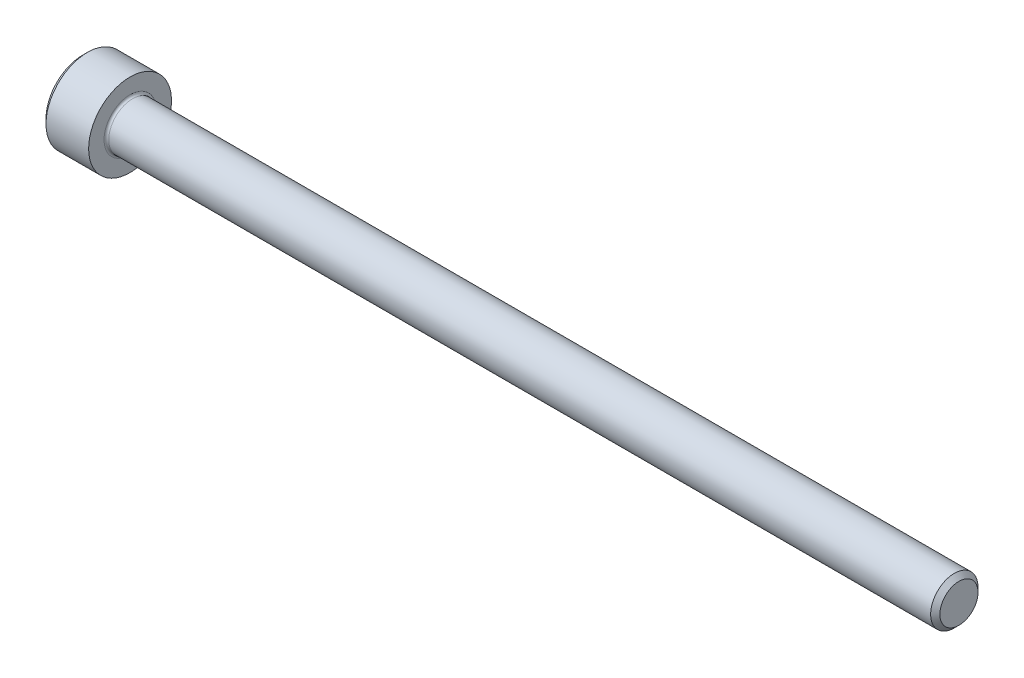
ISO-10303-21;
HEADER;
FILE_DESCRIPTION(('STEP AP214'),'2;1');
FILE_NAME('part.step','',(''),(''),'','','');
FILE_SCHEMA(('AUTOMOTIVE_DESIGN { 1 0 10303 214 1 1 1 1 }'));
ENDSEC;
DATA;
#1=APPLICATION_CONTEXT('core data for automotive mechanical design processes');
#2=APPLICATION_PROTOCOL_DEFINITION('international standard','automotive_design',2000,#1);
#3=PRODUCT_CONTEXT('',#1,'mechanical');
#4=PRODUCT('Part','Part','',(#3));
#5=PRODUCT_RELATED_PRODUCT_CATEGORY('part','',(#4));
#6=PRODUCT_DEFINITION_FORMATION('','',#4);
#7=PRODUCT_DEFINITION_CONTEXT('part definition',#1,'design');
#8=PRODUCT_DEFINITION('design','',#6,#7);
#9=PRODUCT_DEFINITION_SHAPE('','',#8);
#10=(LENGTH_UNIT() NAMED_UNIT(*) SI_UNIT(.MILLI.,.METRE.));
#11=(NAMED_UNIT(*) PLANE_ANGLE_UNIT() SI_UNIT($,.RADIAN.));
#12=(NAMED_UNIT(*) SI_UNIT($,.STERADIAN.) SOLID_ANGLE_UNIT());
#13=UNCERTAINTY_MEASURE_WITH_UNIT(LENGTH_MEASURE(1.E-05),#10,'distance_accuracy_value','');
#14=(GEOMETRIC_REPRESENTATION_CONTEXT(3) GLOBAL_UNCERTAINTY_ASSIGNED_CONTEXT((#13)) GLOBAL_UNIT_ASSIGNED_CONTEXT((#10,
#11,#12)) REPRESENTATION_CONTEXT('',''));
#15=CARTESIAN_POINT('',(0.,0.,0.));
#16=DIRECTION('',(0.,0.,1.));
#17=DIRECTION('',(1.,0.,0.));
#18=AXIS2_PLACEMENT_3D('',#15,#16,#17);
#19=CARTESIAN_POINT('',(0.,0.,0.));
#20=DIRECTION('',(-1.00000000000002,0.,0.));
#21=DIRECTION('',(0.,0.,1.00000000000002));
#22=AXIS2_PLACEMENT_3D('',#19,#20,#21);
#23=PLANE('',#22);
#24=DIRECTION('',(0.,-0.5,0.866025403784461));
#25=VECTOR('',#24,1.);
#26=CARTESIAN_POINT('',(4.32986979603811E-12,1.77304267668088,4.44089209850063E-13));
#27=LINE('',#26,#25);
#28=CARTESIAN_POINT('',(4.32986979603811E-12,1.77304267668088,4.44089209850063E-13));
#29=VERTEX_POINT('',#28);
#30=CARTESIAN_POINT('',(-3.33066907387547E-13,0.886521338340773,1.53550000000324));
#31=VERTEX_POINT('',#30);
#32=EDGE_CURVE('E280',#29,#31,#27,.T.);
#33=ORIENTED_EDGE('',*,*,#32,.T.);
#34=DIRECTION('',(0.,1.00000000000001,0.));
#35=VECTOR('',#34,1.);
#36=CARTESIAN_POINT('',(0.,-0.886521338340662,1.53550000001568));
#37=LINE('',#36,#35);
#38=CARTESIAN_POINT('',(0.,-0.886521338340662,1.53550000001568));
#39=VERTEX_POINT('',#38);
#40=EDGE_CURVE('E140',#39,#31,#37,.T.);
#41=ORIENTED_EDGE('',*,*,#40,.F.);
#42=DIRECTION('',(0.,-0.500000000000002,-0.866025403784466));
#43=VECTOR('',#42,1.);
#44=CARTESIAN_POINT('',(0.,-0.886521338340662,1.53550000001568));
#45=LINE('',#44,#43);
#46=CARTESIAN_POINT('',(2.77555756156289E-12,-1.77304267668132,-8.88178419700125E-12));
#47=VERTEX_POINT('',#46);
#48=EDGE_CURVE('E283',#39,#47,#45,.T.);
#49=ORIENTED_EDGE('',*,*,#48,.T.);
#50=DIRECTION('',(0.,0.5,-0.866025403784461));
#51=VECTOR('',#50,1.);
#52=CARTESIAN_POINT('',(2.77555756156289E-12,-1.77304267668132,-8.88178419700125E-12));
#53=LINE('',#52,#51);
#54=CARTESIAN_POINT('',(0.,-0.886521338340884,-1.53550000001124));
#55=VERTEX_POINT('',#54);
#56=EDGE_CURVE('E286',#47,#55,#53,.T.);
#57=ORIENTED_EDGE('',*,*,#56,.T.);
#58=DIRECTION('',(0.,-1.00000000000001,0.));
#59=VECTOR('',#58,1.);
#60=CARTESIAN_POINT('',(4.32986979603811E-12,0.886521338340884,-1.53550000000102));
#61=LINE('',#60,#59);
#62=CARTESIAN_POINT('',(4.32986979603811E-12,0.886521338340884,-1.53550000000102));
#63=VERTEX_POINT('',#62);
#64=EDGE_CURVE('E289',#63,#55,#61,.T.);
#65=ORIENTED_EDGE('',*,*,#64,.F.);
#66=DIRECTION('',(0.,-0.500000000000002,-0.866025403784466));
#67=VECTOR('',#66,1.);
#68=CARTESIAN_POINT('',(4.32986979603811E-12,1.77304267668088,4.44089209850063E-13));
#69=LINE('',#68,#67);
#70=EDGE_CURVE('E135',#29,#63,#69,.T.);
#71=ORIENTED_EDGE('',*,*,#70,.F.);
#72=EDGE_LOOP('',(#33,#41,#49,#57,#65,#71));
#73=FACE_BOUND('',#72,.T.);
#74=CARTESIAN_POINT('',(0.,0.,0.));
#75=DIRECTION('',(-1.00000000000002,0.,0.));
#76=DIRECTION('',(0.,0.,1.00000000000002));
#77=AXIS2_PLACEMENT_3D('',#74,#75,#76);
#78=CIRCLE('',#77,3.09999999999999);
#79=CARTESIAN_POINT('',(0.,0.,3.10000000000006));
#80=VERTEX_POINT('',#79);
#81=EDGE_CURVE('E164',#80,#80,#78,.T.);
#82=ORIENTED_EDGE('',*,*,#81,.T.);
#83=EDGE_LOOP('',(#82));
#84=FACE_BOUND('',#83,.T.);
#85=ADVANCED_FACE('F48',(#73,#84),#23,.T.);
#86=CARTESIAN_POINT('',(0.,0.,0.));
#87=DIRECTION('',(1.00000000000002,0.,0.));
#88=DIRECTION('',(0.,0.,-1.00000000000002));
#89=AXIS2_PLACEMENT_3D('',#86,#87,#88);
#90=CONICAL_SURFACE('',#89,3.09999999999999,0.785398163397459);
#91=CARTESIAN_POINT('',(0.400000000000067,0.,0.));
#92=DIRECTION('',(-1.00000000000002,0.,0.));
#93=DIRECTION('',(0.,0.,1.00000000000002));
#94=AXIS2_PLACEMENT_3D('',#91,#92,#93);
#95=CIRCLE('',#94,3.5);
#96=CARTESIAN_POINT('',(0.400000000000067,0.,3.50000000000008));
#97=VERTEX_POINT('',#96);
#98=EDGE_CURVE('E161',#97,#97,#95,.T.);
#99=ORIENTED_EDGE('',*,*,#98,.T.);
#100=EDGE_LOOP('',(#99));
#101=FACE_BOUND('',#100,.T.);
#102=ORIENTED_EDGE('',*,*,#81,.F.);
#103=EDGE_LOOP('',(#102));
#104=FACE_BOUND('',#103,.T.);
#105=ADVANCED_FACE('F185',(#101,#104),#90,.T.);
#106=CARTESIAN_POINT('',(-31.7500000000042,1.94289029309402E-13,1.33226762955019E-12));
#107=DIRECTION('',(-1.00000000000002,0.,0.));
#108=DIRECTION('',(0.,0.,1.00000000000002));
#109=AXIS2_PLACEMENT_3D('',#106,#107,#108);
#110=CYLINDRICAL_SURFACE('',#109,3.5);
#111=CARTESIAN_POINT('',(4.,2.22044604925031E-13,4.44089209850063E-13));
#112=DIRECTION('',(-1.00000000000002,0.,0.));
#113=DIRECTION('',(0.,0.,1.00000000000002));
#114=AXIS2_PLACEMENT_3D('',#111,#112,#113);
#115=CIRCLE('',#114,3.5);
#116=CARTESIAN_POINT('',(4.,2.2262747201296E-13,3.50000000000052));
#117=VERTEX_POINT('',#116);
#118=EDGE_CURVE('E158',#117,#117,#115,.T.);
#119=ORIENTED_EDGE('',*,*,#118,.T.);
#120=EDGE_LOOP('',(#119));
#121=FACE_BOUND('',#120,.T.);
#122=ORIENTED_EDGE('',*,*,#98,.F.);
#123=EDGE_LOOP('',(#122));
#124=FACE_BOUND('',#123,.T.);
#125=ADVANCED_FACE('F190',(#121,#124),#110,.T.);
#126=CARTESIAN_POINT('',(4.,3.49999999999939,-1.77635683940025E-12));
#127=DIRECTION('',(1.00000000000002,0.,0.));
#128=DIRECTION('',(0.,0.,-1.00000000000002));
#129=AXIS2_PLACEMENT_3D('',#126,#127,#128);
#130=PLANE('',#129);
#131=CARTESIAN_POINT('',(4.,2.22044604925031E-13,4.44089209850063E-13));
#132=DIRECTION('',(1.00000000000002,0.,0.));
#133=DIRECTION('',(0.,0.,-1.00000000000002));
#134=AXIS2_PLACEMENT_3D('',#131,#132,#133);
#135=CIRCLE('',#134,2.19999999999999);
#136=CARTESIAN_POINT('',(4.,2.21678231326905E-13,-2.19999999999959));
#137=VERTEX_POINT('',#136);
#138=EDGE_CURVE('E56',#137,#137,#135,.F.);
#139=ORIENTED_EDGE('',*,*,#138,.T.);
#140=EDGE_LOOP('',(#139));
#141=FACE_BOUND('',#140,.T.);
#142=ORIENTED_EDGE('',*,*,#118,.F.);
#143=EDGE_LOOP('',(#142));
#144=FACE_BOUND('',#143,.T.);
#145=ADVANCED_FACE('F169',(#141,#144),#130,.T.);
#146=CARTESIAN_POINT('',(-31.7500000000042,1.94289029309402E-13,1.33226762955019E-12));
#147=DIRECTION('',(-1.00000000000002,0.,0.));
#148=DIRECTION('',(0.,0.,1.00000000000002));
#149=AXIS2_PLACEMENT_3D('',#146,#147,#148);
#150=CYLINDRICAL_SURFACE('',#149,1.99999999999999);
#151=CARTESIAN_POINT('',(4.19999999999998,2.22044604925031E-13,4.44089209850063E-13));
#152=DIRECTION('',(1.00000000000002,0.,0.));
#153=DIRECTION('',(0.,0.,-1.00000000000002));
#154=AXIS2_PLACEMENT_3D('',#151,#152,#153);
#155=CIRCLE('',#154,1.99999999999999);
#156=CARTESIAN_POINT('',(4.19999999999998,2.21711538017644E-13,-1.99999999999959));
#157=VERTEX_POINT('',#156);
#158=EDGE_CURVE('E13',#157,#157,#155,.T.);
#159=ORIENTED_EDGE('',*,*,#158,.T.);
#160=EDGE_LOOP('',(#159));
#161=FACE_BOUND('',#160,.T.);
#162=CARTESIAN_POINT('',(73.6100000000003,0.,4.44089209850063E-13));
#163=DIRECTION('',(-1.00000000000002,0.,0.));
#164=DIRECTION('',(0.,0.,1.00000000000002));
#165=AXIS2_PLACEMENT_3D('',#162,#163,#164);
#166=CIRCLE('',#165,1.99999999999997);
#167=CARTESIAN_POINT('',(73.6100000000003,0.,2.00000000000046));
#168=VERTEX_POINT('',#167);
#169=EDGE_CURVE('E155',#168,#168,#166,.T.);
#170=ORIENTED_EDGE('',*,*,#169,.T.);
#171=EDGE_LOOP('',(#170));
#172=FACE_BOUND('',#171,.T.);
#173=ADVANCED_FACE('F200',(#161,#172),#150,.T.);
#174=CARTESIAN_POINT('',(74.0000000000003,0.,4.44089209850063E-13));
#175=DIRECTION('',(-1.00000000000002,0.,0.));
#176=DIRECTION('',(0.,0.,1.00000000000002));
#177=AXIS2_PLACEMENT_3D('',#174,#175,#176);
#178=CONICAL_SURFACE('',#177,1.61,0.785398163397393);
#179=ORIENTED_EDGE('',*,*,#169,.F.);
#180=EDGE_LOOP('',(#179));
#181=FACE_BOUND('',#180,.T.);
#182=CARTESIAN_POINT('',(74.0000000000003,0.,4.44089209850063E-13));
#183=DIRECTION('',(-1.00000000000002,0.,0.));
#184=DIRECTION('',(0.,0.,1.00000000000002));
#185=AXIS2_PLACEMENT_3D('',#182,#183,#184);
#186=CIRCLE('',#185,1.61);
#187=CARTESIAN_POINT('',(74.0000000000003,0.,1.61000000000048));
#188=VERTEX_POINT('',#187);
#189=EDGE_CURVE('E151',#188,#188,#186,.T.);
#190=ORIENTED_EDGE('',*,*,#189,.T.);
#191=EDGE_LOOP('',(#190));
#192=FACE_BOUND('',#191,.T.);
#193=ADVANCED_FACE('F180',(#181,#192),#178,.T.);
#194=CARTESIAN_POINT('',(74.0000000000048,1.6099999999992,0.));
#195=DIRECTION('',(1.00000000000002,0.,0.));
#196=DIRECTION('',(0.,0.,-1.00000000000002));
#197=AXIS2_PLACEMENT_3D('',#194,#195,#196);
#198=PLANE('',#197);
#199=ORIENTED_EDGE('',*,*,#189,.F.);
#200=EDGE_LOOP('',(#199));
#201=FACE_BOUND('',#200,.T.);
#202=ADVANCED_FACE('F173',(#201),#198,.T.);
#203=CARTESIAN_POINT('',(4.19999999999998,2.22044604925031E-13,4.44089209850063E-13));
#204=DIRECTION('',(1.00000000000002,0.,0.));
#205=DIRECTION('',(0.,0.,-1.00000000000002));
#206=AXIS2_PLACEMENT_3D('',#203,#204,#205);
#207=TOROIDAL_SURFACE('',#206,2.19999999999999,0.2);
#208=ORIENTED_EDGE('',*,*,#158,.F.);
#209=EDGE_LOOP('',(#208));
#210=FACE_BOUND('',#209,.T.);
#211=ORIENTED_EDGE('',*,*,#138,.F.);
#212=EDGE_LOOP('',(#211));
#213=FACE_BOUND('',#212,.T.);
#214=ADVANCED_FACE('F50',(#210,#213),#207,.F.);
#215=CARTESIAN_POINT('',(2.00000000000444,1.77304267668155,8.88178419700125E-13));
#216=DIRECTION('',(0.,-0.86602540378444,-0.500000000000009));
#217=DIRECTION('',(0.,0.5,-0.866025403784461));
#218=AXIS2_PLACEMENT_3D('',#215,#216,#217);
#219=PLANE('',#218);
#220=ORIENTED_EDGE('',*,*,#32,.F.);
#221=DIRECTION('',(-1.00000000000002,0.,0.));
#222=VECTOR('',#221,1.);
#223=CARTESIAN_POINT('',(2.00000000000444,1.77304267668155,8.88178419700125E-13));
#224=LINE('',#223,#222);
#225=CARTESIAN_POINT('',(2.00000000000444,1.77304267668155,8.88178419700125E-13));
#226=VERTEX_POINT('',#225);
#227=EDGE_CURVE('E279',#226,#29,#224,.T.);
#228=ORIENTED_EDGE('',*,*,#227,.F.);
#229=DIRECTION('',(0.,-0.5,0.866025403784461));
#230=VECTOR('',#229,1.);
#231=CARTESIAN_POINT('',(2.00000000000444,1.77304267668155,8.88178419700125E-13));
#232=LINE('',#231,#230);
#233=CARTESIAN_POINT('',(2.,1.32978200751088,0.767750000003176));
#234=VERTEX_POINT('',#233);
#235=EDGE_CURVE('E63',#226,#234,#232,.T.);
#236=ORIENTED_EDGE('',*,*,#235,.T.);
#237=CARTESIAN_POINT('',(1.99999999999978,0.886521338340662,1.53550000000235));
#238=VERTEX_POINT('',#237);
#239=EDGE_CURVE('E121',#234,#238,#232,.T.);
#240=ORIENTED_EDGE('',*,*,#239,.T.);
#241=DIRECTION('',(-1.00000000000002,0.,0.));
#242=VECTOR('',#241,1.);
#243=CARTESIAN_POINT('',(1.99999999999978,0.886521338340662,1.53550000000235));
#244=LINE('',#243,#242);
#245=EDGE_CURVE('E133',#238,#31,#244,.T.);
#246=ORIENTED_EDGE('',*,*,#245,.T.);
#247=EDGE_LOOP('',(#220,#228,#236,#240,#246));
#248=FACE_BOUND('',#247,.T.);
#249=ADVANCED_FACE('F132',(#248),#219,.T.);
#250=CARTESIAN_POINT('',(2.,-0.886521338341106,1.53550000001523));
#251=DIRECTION('',(0.,0.,1.00000000000003));
#252=DIRECTION('',(0.,-1.00000000000001,0.));
#253=AXIS2_PLACEMENT_3D('',#250,#251,#252);
#254=PLANE('',#253);
#255=ORIENTED_EDGE('',*,*,#40,.T.);
#256=ORIENTED_EDGE('',*,*,#245,.F.);
#257=DIRECTION('',(0.,1.00000000000001,0.));
#258=VECTOR('',#257,1.);
#259=CARTESIAN_POINT('',(2.,-0.886521338341106,1.53550000001523));
#260=LINE('',#259,#258);
#261=CARTESIAN_POINT('',(2.,2.22044604925031E-13,1.53550000000457));
#262=VERTEX_POINT('',#261);
#263=EDGE_CURVE('E119',#262,#238,#260,.T.);
#264=ORIENTED_EDGE('',*,*,#263,.F.);
#265=CARTESIAN_POINT('',(2.,-0.886521338341106,1.53550000001523));
#266=VERTEX_POINT('',#265);
#267=EDGE_CURVE('E129',#266,#262,#260,.T.);
#268=ORIENTED_EDGE('',*,*,#267,.F.);
#269=DIRECTION('',(-1.00000000000002,0.,0.));
#270=VECTOR('',#269,1.);
#271=CARTESIAN_POINT('',(2.,-0.886521338341106,1.53550000001523));
#272=LINE('',#271,#270);
#273=EDGE_CURVE('E142',#266,#39,#272,.T.);
#274=ORIENTED_EDGE('',*,*,#273,.T.);
#275=EDGE_LOOP('',(#255,#256,#264,#268,#274));
#276=FACE_BOUND('',#275,.T.);
#277=ADVANCED_FACE('F137',(#276),#254,.F.);
#278=CARTESIAN_POINT('',(2.,-0.886521338341106,1.53550000001523));
#279=DIRECTION('',(0.,0.866025403784445,-0.500000000000013));
#280=DIRECTION('',(0.,0.500000000000002,0.866025403784466));
#281=AXIS2_PLACEMENT_3D('',#278,#279,#280);
#282=PLANE('',#281);
#283=ORIENTED_EDGE('',*,*,#48,.F.);
#284=ORIENTED_EDGE('',*,*,#273,.F.);
#285=DIRECTION('',(0.,-0.500000000000002,-0.866025403784466));
#286=VECTOR('',#285,1.);
#287=CARTESIAN_POINT('',(2.,-0.886521338341106,1.53550000001523));
#288=LINE('',#287,#286);
#289=CARTESIAN_POINT('',(2.,-1.32978200751166,0.76775000000584));
#290=VERTEX_POINT('',#289);
#291=EDGE_CURVE('E260',#266,#290,#288,.T.);
#292=ORIENTED_EDGE('',*,*,#291,.T.);
#293=CARTESIAN_POINT('',(2.00000000000278,-1.7730426766811,-9.32587340685131E-12));
#294=VERTEX_POINT('',#293);
#295=EDGE_CURVE('E262',#290,#294,#288,.T.);
#296=ORIENTED_EDGE('',*,*,#295,.T.);
#297=DIRECTION('',(-1.00000000000002,0.,0.));
#298=VECTOR('',#297,1.);
#299=CARTESIAN_POINT('',(2.00000000000278,-1.7730426766811,-9.32587340685131E-12));
#300=LINE('',#299,#298);
#301=EDGE_CURVE('E147',#294,#47,#300,.T.);
#302=ORIENTED_EDGE('',*,*,#301,.T.);
#303=EDGE_LOOP('',(#283,#284,#292,#296,#302));
#304=FACE_BOUND('',#303,.T.);
#305=ADVANCED_FACE('F212',(#304),#282,.T.);
#306=CARTESIAN_POINT('',(2.00000000000278,-1.7730426766811,-9.32587340685131E-12));
#307=DIRECTION('',(0.,0.86602540378444,0.500000000000009));
#308=DIRECTION('',(0.,-0.5,0.866025403784461));
#309=AXIS2_PLACEMENT_3D('',#306,#307,#308);
#310=PLANE('',#309);
#311=ORIENTED_EDGE('',*,*,#56,.F.);
#312=ORIENTED_EDGE('',*,*,#301,.F.);
#313=DIRECTION('',(0.,0.5,-0.866025403784461));
#314=VECTOR('',#313,1.);
#315=CARTESIAN_POINT('',(2.00000000000278,-1.7730426766811,-9.32587340685131E-12));
#316=LINE('',#315,#314);
#317=CARTESIAN_POINT('',(1.99999999999978,-1.32978200751088,-0.767750000012501));
#318=VERTEX_POINT('',#317);
#319=EDGE_CURVE('E265',#294,#318,#316,.T.);
#320=ORIENTED_EDGE('',*,*,#319,.T.);
#321=CARTESIAN_POINT('',(2.,-0.88652133834044,-1.53550000001168));
#322=VERTEX_POINT('',#321);
#323=EDGE_CURVE('E269',#318,#322,#316,.T.);
#324=ORIENTED_EDGE('',*,*,#323,.T.);
#325=DIRECTION('',(-1.00000000000002,0.,0.));
#326=VECTOR('',#325,1.);
#327=CARTESIAN_POINT('',(2.,-0.88652133834044,-1.53550000001168));
#328=LINE('',#327,#326);
#329=EDGE_CURVE('E298',#322,#55,#328,.T.);
#330=ORIENTED_EDGE('',*,*,#329,.T.);
#331=EDGE_LOOP('',(#311,#312,#320,#324,#330));
#332=FACE_BOUND('',#331,.T.);
#333=ADVANCED_FACE('F215',(#332),#310,.T.);
#334=CARTESIAN_POINT('',(2.00000000000444,0.886521338341772,-1.53549999999925));
#335=DIRECTION('',(0.,0.,-1.00000000000003));
#336=DIRECTION('',(0.,1.00000000000001,0.));
#337=AXIS2_PLACEMENT_3D('',#334,#335,#336);
#338=PLANE('',#337);
#339=ORIENTED_EDGE('',*,*,#64,.T.);
#340=ORIENTED_EDGE('',*,*,#329,.F.);
#341=DIRECTION('',(0.,-1.00000000000001,0.));
#342=VECTOR('',#341,1.);
#343=CARTESIAN_POINT('',(2.00000000000444,0.886521338341772,-1.53549999999925));
#344=LINE('',#343,#342);
#345=CARTESIAN_POINT('',(2.00000000000444,0.,-1.53550000000013));
#346=VERTEX_POINT('',#345);
#347=EDGE_CURVE('E273',#346,#322,#344,.T.);
#348=ORIENTED_EDGE('',*,*,#347,.F.);
#349=CARTESIAN_POINT('',(2.00000000000444,0.886521338341772,-1.53549999999925));
#350=VERTEX_POINT('',#349);
#351=EDGE_CURVE('E274',#350,#346,#344,.T.);
#352=ORIENTED_EDGE('',*,*,#351,.F.);
#353=DIRECTION('',(-1.00000000000002,0.,0.));
#354=VECTOR('',#353,1.);
#355=CARTESIAN_POINT('',(2.00000000000444,0.886521338341772,-1.53549999999925));
#356=LINE('',#355,#354);
#357=EDGE_CURVE('E295',#350,#63,#356,.T.);
#358=ORIENTED_EDGE('',*,*,#357,.T.);
#359=EDGE_LOOP('',(#339,#340,#348,#352,#358));
#360=FACE_BOUND('',#359,.T.);
#361=ADVANCED_FACE('F219',(#360),#338,.F.);
#362=CARTESIAN_POINT('',(2.00000000000444,1.77304267668155,8.88178419700125E-13));
#363=DIRECTION('',(0.,0.866025403784445,-0.500000000000013));
#364=DIRECTION('',(0.,0.500000000000002,0.866025403784466));
#365=AXIS2_PLACEMENT_3D('',#362,#363,#364);
#366=PLANE('',#365);
#367=ORIENTED_EDGE('',*,*,#70,.T.);
#368=ORIENTED_EDGE('',*,*,#357,.F.);
#369=DIRECTION('',(0.,-0.500000000000002,-0.866025403784466));
#370=VECTOR('',#369,1.);
#371=CARTESIAN_POINT('',(2.00000000000444,1.77304267668155,8.88178419700125E-13));
#372=LINE('',#371,#370);
#373=CARTESIAN_POINT('',(2.00000000000444,1.32978200751244,-0.76775000001561));
#374=VERTEX_POINT('',#373);
#375=EDGE_CURVE('E277',#374,#350,#372,.T.);
#376=ORIENTED_EDGE('',*,*,#375,.F.);
#377=EDGE_CURVE('E251',#226,#374,#372,.T.);
#378=ORIENTED_EDGE('',*,*,#377,.F.);
#379=ORIENTED_EDGE('',*,*,#227,.T.);
#380=EDGE_LOOP('',(#367,#368,#376,#378,#379));
#381=FACE_BOUND('',#380,.T.);
#382=ADVANCED_FACE('F223',(#381),#366,.F.);
#383=CARTESIAN_POINT('',(1.99999999999978,0.886521338340662,1.53550000000235));
#384=DIRECTION('',(-1.00000000000002,0.,0.));
#385=DIRECTION('',(0.,0.,1.00000000000002));
#386=AXIS2_PLACEMENT_3D('',#383,#384,#385);
#387=PLANE('',#386);
#388=CARTESIAN_POINT('',(2.,0.,1.77635683940025E-12));
#389=DIRECTION('',(-1.00000000000002,0.,0.));
#390=DIRECTION('',(0.,0.,1.00000000000002));
#391=AXIS2_PLACEMENT_3D('',#388,#389,#390);
#392=CIRCLE('',#391,1.5355);
#393=EDGE_CURVE('E141',#290,#262,#392,.T.);
#394=ORIENTED_EDGE('',*,*,#393,.F.);
#395=ORIENTED_EDGE('',*,*,#291,.F.);
#396=ORIENTED_EDGE('',*,*,#267,.T.);
#397=EDGE_LOOP('',(#394,#395,#396));
#398=FACE_BOUND('',#397,.T.);
#399=ADVANCED_FACE('F227',(#398),#387,.T.);
#400=EDGE_CURVE('E145',#318,#290,#392,.T.);
#401=ORIENTED_EDGE('',*,*,#400,.F.);
#402=ORIENTED_EDGE('',*,*,#319,.F.);
#403=ORIENTED_EDGE('',*,*,#295,.F.);
#404=EDGE_LOOP('',(#401,#402,#403));
#405=FACE_BOUND('',#404,.T.);
#406=ADVANCED_FACE('F230',(#405),#387,.T.);
#407=EDGE_CURVE('E304',#346,#318,#392,.T.);
#408=ORIENTED_EDGE('',*,*,#407,.F.);
#409=ORIENTED_EDGE('',*,*,#347,.T.);
#410=ORIENTED_EDGE('',*,*,#323,.F.);
#411=EDGE_LOOP('',(#408,#409,#410));
#412=FACE_BOUND('',#411,.T.);
#413=ADVANCED_FACE('F235',(#412),#387,.T.);
#414=EDGE_CURVE('E254',#374,#346,#392,.T.);
#415=ORIENTED_EDGE('',*,*,#414,.F.);
#416=ORIENTED_EDGE('',*,*,#375,.T.);
#417=ORIENTED_EDGE('',*,*,#351,.T.);
#418=EDGE_LOOP('',(#415,#416,#417));
#419=FACE_BOUND('',#418,.T.);
#420=ADVANCED_FACE('F242',(#419),#387,.T.);
#421=EDGE_CURVE('E152',#234,#374,#392,.T.);
#422=ORIENTED_EDGE('',*,*,#421,.F.);
#423=ORIENTED_EDGE('',*,*,#235,.F.);
#424=ORIENTED_EDGE('',*,*,#377,.T.);
#425=EDGE_LOOP('',(#422,#423,#424));
#426=FACE_BOUND('',#425,.T.);
#427=ADVANCED_FACE('F238',(#426),#387,.T.);
#428=EDGE_CURVE('E124',#262,#234,#392,.T.);
#429=ORIENTED_EDGE('',*,*,#428,.F.);
#430=ORIENTED_EDGE('',*,*,#263,.T.);
#431=ORIENTED_EDGE('',*,*,#239,.F.);
#432=EDGE_LOOP('',(#429,#430,#431));
#433=FACE_BOUND('',#432,.T.);
#434=ADVANCED_FACE('F120',(#433),#387,.T.);
#435=CARTESIAN_POINT('',(2.,0.,1.77635683940025E-12));
#436=DIRECTION('',(-1.00000000000002,0.,0.));
#437=DIRECTION('',(0.,0.,1.00000000000002));
#438=AXIS2_PLACEMENT_3D('',#435,#436,#437);
#439=CONICAL_SURFACE('',#438,1.5355,1.04719755119659);
#440=CARTESIAN_POINT('',(2.88652133834066,4.44089209850063E-13,1.77635683940025E-12));
#441=VERTEX_POINT('',#440);
#442=VERTEX_LOOP('',#441);
#443=FACE_BOUND('',#442,.T.);
#444=ORIENTED_EDGE('',*,*,#428,.T.);
#445=ORIENTED_EDGE('',*,*,#421,.T.);
#446=ORIENTED_EDGE('',*,*,#414,.T.);
#447=ORIENTED_EDGE('',*,*,#407,.T.);
#448=ORIENTED_EDGE('',*,*,#400,.T.);
#449=ORIENTED_EDGE('',*,*,#393,.T.);
#450=EDGE_LOOP('',(#444,#445,#446,#447,#448,#449));
#451=FACE_BOUND('',#450,.T.);
#452=ADVANCED_FACE('F207',(#443,#451),#439,.F.);
#453=CLOSED_SHELL('',(#85,#105,#125,#145,#173,#193,#202,#214,#249,#277,#305,#333,#361,#382,#399,
#406,#413,#420,#427,#434,#452));
#454=MANIFOLD_SOLID_BREP('B2',#453);
#455=ADVANCED_BREP_SHAPE_REPRESENTATION('',(#18,#454),#14);
#456=SHAPE_DEFINITION_REPRESENTATION(#9,#455);
ENDSEC;
END-ISO-10303-21;
